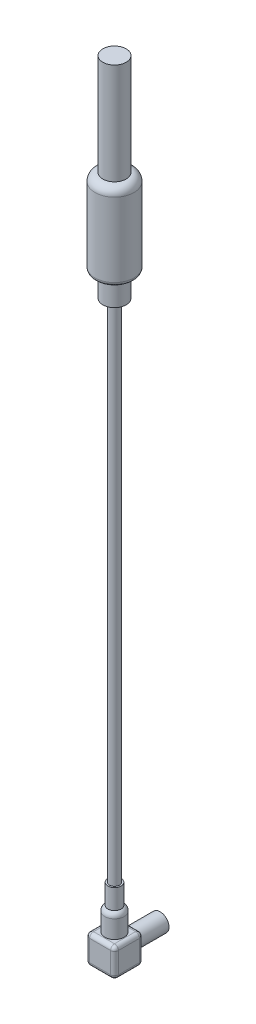
ISO-10303-21;
HEADER;
FILE_DESCRIPTION(('STEP AP214'),'2;1');
FILE_NAME('part.step','',(''),(''),'','','');
FILE_SCHEMA(('AUTOMOTIVE_DESIGN { 1 0 10303 214 1 1 1 1 }'));
ENDSEC;
DATA;
#1=APPLICATION_CONTEXT('core data for automotive mechanical design processes');
#2=APPLICATION_PROTOCOL_DEFINITION('international standard','automotive_design',2000,#1);
#3=PRODUCT_CONTEXT('',#1,'mechanical');
#4=PRODUCT('Part','Part','',(#3));
#5=PRODUCT_RELATED_PRODUCT_CATEGORY('part','',(#4));
#6=PRODUCT_DEFINITION_FORMATION('','',#4);
#7=PRODUCT_DEFINITION_CONTEXT('part definition',#1,'design');
#8=PRODUCT_DEFINITION('design','',#6,#7);
#9=PRODUCT_DEFINITION_SHAPE('','',#8);
#10=(LENGTH_UNIT() NAMED_UNIT(*) SI_UNIT(.MILLI.,.METRE.));
#11=(NAMED_UNIT(*) PLANE_ANGLE_UNIT() SI_UNIT($,.RADIAN.));
#12=(NAMED_UNIT(*) SI_UNIT($,.STERADIAN.) SOLID_ANGLE_UNIT());
#13=UNCERTAINTY_MEASURE_WITH_UNIT(LENGTH_MEASURE(1.E-05),#10,'distance_accuracy_value','');
#14=(GEOMETRIC_REPRESENTATION_CONTEXT(3) GLOBAL_UNCERTAINTY_ASSIGNED_CONTEXT((#13)) GLOBAL_UNIT_ASSIGNED_CONTEXT((#10,
#11,#12)) REPRESENTATION_CONTEXT('',''));
#15=CARTESIAN_POINT('',(0.,0.,0.));
#16=DIRECTION('',(0.,0.,1.));
#17=DIRECTION('',(1.,0.,0.));
#18=AXIS2_PLACEMENT_3D('',#15,#16,#17);
#19=CARTESIAN_POINT('',(0.,0.,4.));
#20=DIRECTION('',(0.,0.,-1.));
#21=DIRECTION('',(-1.,0.,0.));
#22=AXIS2_PLACEMENT_3D('',#19,#20,#21);
#23=CYLINDRICAL_SURFACE('',#22,1.15);
#24=CARTESIAN_POINT('',(0.,0.,4.));
#25=DIRECTION('',(0.,0.,1.));
#26=DIRECTION('',(1.,0.,0.));
#27=AXIS2_PLACEMENT_3D('',#24,#25,#26);
#28=CIRCLE('',#27,1.15);
#29=CARTESIAN_POINT('',(1.15,0.,4.));
#30=VERTEX_POINT('',#29);
#31=EDGE_CURVE('E174',#30,#30,#28,.T.);
#32=ORIENTED_EDGE('',*,*,#31,.F.);
#33=EDGE_LOOP('',(#32));
#34=FACE_BOUND('',#33,.T.);
#35=CARTESIAN_POINT('',(0.,0.,0.));
#36=DIRECTION('',(0.,0.,1.));
#37=DIRECTION('',(1.,0.,0.));
#38=AXIS2_PLACEMENT_3D('',#35,#36,#37);
#39=CIRCLE('',#38,1.15);
#40=CARTESIAN_POINT('',(1.15,0.,0.));
#41=VERTEX_POINT('',#40);
#42=EDGE_CURVE('E177',#41,#41,#39,.T.);
#43=ORIENTED_EDGE('',*,*,#42,.T.);
#44=EDGE_LOOP('',(#43));
#45=FACE_BOUND('',#44,.T.);
#46=ADVANCED_FACE('F47',(#34,#45),#23,.T.);
#47=CARTESIAN_POINT('',(0.,0.,0.));
#48=DIRECTION('',(0.,0.,1.));
#49=DIRECTION('',(1.,0.,0.));
#50=AXIS2_PLACEMENT_3D('',#47,#48,#49);
#51=PLANE('',#50);
#52=ORIENTED_EDGE('',*,*,#42,.F.);
#53=EDGE_LOOP('',(#52));
#54=FACE_BOUND('',#53,.T.);
#55=ADVANCED_FACE('F413',(#54),#51,.F.);
#56=CARTESIAN_POINT('',(-1.85,-1.85,7.7));
#57=DIRECTION('',(1.,0.,0.));
#58=DIRECTION('',(0.,0.,-1.));
#59=AXIS2_PLACEMENT_3D('',#56,#57,#58);
#60=PLANE('',#59);
#61=DIRECTION('',(0.,0.,-1.));
#62=VECTOR('',#61,1.);
#63=CARTESIAN_POINT('',(-1.85,1.35,7.7));
#64=LINE('',#63,#62);
#65=CARTESIAN_POINT('',(-1.85,1.35,7.2));
#66=VERTEX_POINT('',#65);
#67=CARTESIAN_POINT('',(-1.85,1.35,4.5));
#68=VERTEX_POINT('',#67);
#69=EDGE_CURVE('E145',#66,#68,#64,.T.);
#70=ORIENTED_EDGE('',*,*,#69,.T.);
#71=DIRECTION('',(0.,-1.,0.));
#72=VECTOR('',#71,1.);
#73=CARTESIAN_POINT('',(-1.85,-1.85,4.5));
#74=LINE('',#73,#72);
#75=CARTESIAN_POINT('',(-1.85,-1.35,4.5));
#76=VERTEX_POINT('',#75);
#77=EDGE_CURVE('E184',#68,#76,#74,.T.);
#78=ORIENTED_EDGE('',*,*,#77,.T.);
#79=DIRECTION('',(0.,0.,-1.));
#80=VECTOR('',#79,1.);
#81=CARTESIAN_POINT('',(-1.85,-1.35,7.7));
#82=LINE('',#81,#80);
#83=CARTESIAN_POINT('',(-1.85,-1.35,7.2));
#84=VERTEX_POINT('',#83);
#85=EDGE_CURVE('E143',#76,#84,#82,.F.);
#86=ORIENTED_EDGE('',*,*,#85,.T.);
#87=DIRECTION('',(0.,-1.,0.));
#88=VECTOR('',#87,1.);
#89=CARTESIAN_POINT('',(-1.85,1.85,7.2));
#90=LINE('',#89,#88);
#91=EDGE_CURVE('E140',#84,#66,#90,.F.);
#92=ORIENTED_EDGE('',*,*,#91,.T.);
#93=EDGE_LOOP('',(#70,#78,#86,#92));
#94=FACE_BOUND('',#93,.T.);
#95=ADVANCED_FACE('F137',(#94),#60,.F.);
#96=CARTESIAN_POINT('',(1.85,-1.85,7.7));
#97=DIRECTION('',(0.,1.,0.));
#98=DIRECTION('',(-1.,0.,0.));
#99=AXIS2_PLACEMENT_3D('',#96,#97,#98);
#100=PLANE('',#99);
#101=DIRECTION('',(0.,0.,-1.));
#102=VECTOR('',#101,1.);
#103=CARTESIAN_POINT('',(-1.35,-1.85,7.7));
#104=LINE('',#103,#102);
#105=CARTESIAN_POINT('',(-1.35,-1.85,7.2));
#106=VERTEX_POINT('',#105);
#107=CARTESIAN_POINT('',(-1.35,-1.85,4.5));
#108=VERTEX_POINT('',#107);
#109=EDGE_CURVE('E231',#106,#108,#104,.T.);
#110=ORIENTED_EDGE('',*,*,#109,.T.);
#111=DIRECTION('',(1.,0.,0.));
#112=VECTOR('',#111,1.);
#113=CARTESIAN_POINT('',(1.85,-1.85,4.5));
#114=LINE('',#113,#112);
#115=CARTESIAN_POINT('',(1.35,-1.85,4.5));
#116=VERTEX_POINT('',#115);
#117=EDGE_CURVE('E236',#108,#116,#114,.T.);
#118=ORIENTED_EDGE('',*,*,#117,.T.);
#119=DIRECTION('',(0.,0.,-1.));
#120=VECTOR('',#119,1.);
#121=CARTESIAN_POINT('',(1.35,-1.85,7.7));
#122=LINE('',#121,#120);
#123=CARTESIAN_POINT('',(1.35,-1.85,7.2));
#124=VERTEX_POINT('',#123);
#125=EDGE_CURVE('E229',#116,#124,#122,.F.);
#126=ORIENTED_EDGE('',*,*,#125,.T.);
#127=DIRECTION('',(1.,0.,0.));
#128=VECTOR('',#127,1.);
#129=CARTESIAN_POINT('',(-1.85,-1.85,7.2));
#130=LINE('',#129,#128);
#131=EDGE_CURVE('E227',#124,#106,#130,.F.);
#132=ORIENTED_EDGE('',*,*,#131,.T.);
#133=EDGE_LOOP('',(#110,#118,#126,#132));
#134=FACE_BOUND('',#133,.T.);
#135=ADVANCED_FACE('F544',(#134),#100,.F.);
#136=CARTESIAN_POINT('',(1.85,-1.85,7.7));
#137=DIRECTION('',(-1.,0.,0.));
#138=DIRECTION('',(0.,0.,1.));
#139=AXIS2_PLACEMENT_3D('',#136,#137,#138);
#140=PLANE('',#139);
#141=DIRECTION('',(0.,0.,-1.));
#142=VECTOR('',#141,1.);
#143=CARTESIAN_POINT('',(1.85,-1.35,7.7));
#144=LINE('',#143,#142);
#145=CARTESIAN_POINT('',(1.85,-1.35,7.2));
#146=VERTEX_POINT('',#145);
#147=CARTESIAN_POINT('',(1.85,-1.35,4.5));
#148=VERTEX_POINT('',#147);
#149=EDGE_CURVE('E219',#146,#148,#144,.T.);
#150=ORIENTED_EDGE('',*,*,#149,.T.);
#151=DIRECTION('',(0.,1.,0.));
#152=VECTOR('',#151,1.);
#153=CARTESIAN_POINT('',(1.85,-1.85,4.5));
#154=LINE('',#153,#152);
#155=CARTESIAN_POINT('',(1.85,1.35,4.5));
#156=VERTEX_POINT('',#155);
#157=EDGE_CURVE('E223',#148,#156,#154,.T.);
#158=ORIENTED_EDGE('',*,*,#157,.T.);
#159=DIRECTION('',(0.,0.,-1.));
#160=VECTOR('',#159,1.);
#161=CARTESIAN_POINT('',(1.85,1.35,7.7));
#162=LINE('',#161,#160);
#163=CARTESIAN_POINT('',(1.85,1.35,7.2));
#164=VERTEX_POINT('',#163);
#165=EDGE_CURVE('E211',#156,#164,#162,.F.);
#166=ORIENTED_EDGE('',*,*,#165,.T.);
#167=DIRECTION('',(0.,1.,0.));
#168=VECTOR('',#167,1.);
#169=CARTESIAN_POINT('',(1.85,-1.85,7.2));
#170=LINE('',#169,#168);
#171=EDGE_CURVE('E220',#164,#146,#170,.F.);
#172=ORIENTED_EDGE('',*,*,#171,.T.);
#173=EDGE_LOOP('',(#150,#158,#166,#172));
#174=FACE_BOUND('',#173,.T.);
#175=ADVANCED_FACE('F537',(#174),#140,.F.);
#176=CARTESIAN_POINT('',(1.85,1.85,7.7));
#177=DIRECTION('',(0.,-1.,0.));
#178=DIRECTION('',(1.,0.,0.));
#179=AXIS2_PLACEMENT_3D('',#176,#177,#178);
#180=PLANE('',#179);
#181=CARTESIAN_POINT('',(0.,1.85,5.85));
#182=DIRECTION('',(0.,-1.,0.));
#183=DIRECTION('',(1.,0.,0.));
#184=AXIS2_PLACEMENT_3D('',#181,#182,#183);
#185=CIRCLE('',#184,1.25);
#186=CARTESIAN_POINT('',(1.25,1.85,5.85));
#187=VERTEX_POINT('',#186);
#188=EDGE_CURVE('E249',#187,#187,#185,.F.);
#189=ORIENTED_EDGE('',*,*,#188,.F.);
#190=EDGE_LOOP('',(#189));
#191=FACE_BOUND('',#190,.T.);
#192=DIRECTION('',(-1.,0.,0.));
#193=VECTOR('',#192,1.);
#194=CARTESIAN_POINT('',(1.85,1.85,4.5));
#195=LINE('',#194,#193);
#196=CARTESIAN_POINT('',(1.35,1.85,4.5));
#197=VERTEX_POINT('',#196);
#198=CARTESIAN_POINT('',(-1.35,1.85,4.5));
#199=VERTEX_POINT('',#198);
#200=EDGE_CURVE('E210',#197,#199,#195,.T.);
#201=ORIENTED_EDGE('',*,*,#200,.T.);
#202=DIRECTION('',(0.,0.,-1.));
#203=VECTOR('',#202,1.);
#204=CARTESIAN_POINT('',(-1.35,1.85,7.7));
#205=LINE('',#204,#203);
#206=CARTESIAN_POINT('',(-1.35,1.85,7.2));
#207=VERTEX_POINT('',#206);
#208=EDGE_CURVE('E212',#199,#207,#205,.F.);
#209=ORIENTED_EDGE('',*,*,#208,.T.);
#210=DIRECTION('',(-1.,0.,0.));
#211=VECTOR('',#210,1.);
#212=CARTESIAN_POINT('',(1.85,1.85,7.2));
#213=LINE('',#212,#211);
#214=CARTESIAN_POINT('',(1.35,1.85,7.2));
#215=VERTEX_POINT('',#214);
#216=EDGE_CURVE('E202',#207,#215,#213,.F.);
#217=ORIENTED_EDGE('',*,*,#216,.T.);
#218=DIRECTION('',(0.,0.,-1.));
#219=VECTOR('',#218,1.);
#220=CARTESIAN_POINT('',(1.35,1.85,7.7));
#221=LINE('',#220,#219);
#222=EDGE_CURVE('E201',#215,#197,#221,.T.);
#223=ORIENTED_EDGE('',*,*,#222,.T.);
#224=EDGE_LOOP('',(#201,#209,#217,#223));
#225=FACE_BOUND('',#224,.T.);
#226=ADVANCED_FACE('F517',(#191,#225),#180,.F.);
#227=CARTESIAN_POINT('',(0.,0.,7.7));
#228=DIRECTION('',(0.,0.,1.));
#229=DIRECTION('',(1.,0.,0.));
#230=AXIS2_PLACEMENT_3D('',#227,#228,#229);
#231=PLANE('',#230);
#232=DIRECTION('',(0.,-1.,0.));
#233=VECTOR('',#232,1.);
#234=CARTESIAN_POINT('',(-1.35,-1.85,7.7));
#235=LINE('',#234,#233);
#236=CARTESIAN_POINT('',(-1.35,1.35,7.7));
#237=VERTEX_POINT('',#236);
#238=CARTESIAN_POINT('',(-1.35,-1.35,7.7));
#239=VERTEX_POINT('',#238);
#240=EDGE_CURVE('E69',#237,#239,#235,.T.);
#241=ORIENTED_EDGE('',*,*,#240,.T.);
#242=DIRECTION('',(1.,0.,0.));
#243=VECTOR('',#242,1.);
#244=CARTESIAN_POINT('',(1.85,-1.35,7.7));
#245=LINE('',#244,#243);
#246=CARTESIAN_POINT('',(1.35,-1.35,7.7));
#247=VERTEX_POINT('',#246);
#248=EDGE_CURVE('E63',#239,#247,#245,.T.);
#249=ORIENTED_EDGE('',*,*,#248,.T.);
#250=DIRECTION('',(0.,1.,0.));
#251=VECTOR('',#250,1.);
#252=CARTESIAN_POINT('',(1.35,1.85,7.7));
#253=LINE('',#252,#251);
#254=CARTESIAN_POINT('',(1.35,1.35,7.7));
#255=VERTEX_POINT('',#254);
#256=EDGE_CURVE('E244',#247,#255,#253,.T.);
#257=ORIENTED_EDGE('',*,*,#256,.T.);
#258=DIRECTION('',(-1.,0.,0.));
#259=VECTOR('',#258,1.);
#260=CARTESIAN_POINT('',(-1.85,1.35,7.7));
#261=LINE('',#260,#259);
#262=EDGE_CURVE('E239',#255,#237,#261,.T.);
#263=ORIENTED_EDGE('',*,*,#262,.T.);
#264=EDGE_LOOP('',(#241,#249,#257,#263));
#265=FACE_BOUND('',#264,.T.);
#266=ADVANCED_FACE('F505',(#265),#231,.T.);
#267=CARTESIAN_POINT('',(0.,0.,4.));
#268=DIRECTION('',(0.,0.,1.));
#269=DIRECTION('',(1.,0.,0.));
#270=AXIS2_PLACEMENT_3D('',#267,#268,#269);
#271=PLANE('',#270);
#272=DIRECTION('',(1.,0.,0.));
#273=VECTOR('',#272,1.);
#274=CARTESIAN_POINT('',(0.,-1.35,4.));
#275=LINE('',#274,#273);
#276=CARTESIAN_POINT('',(1.35,-1.35,4.));
#277=VERTEX_POINT('',#276);
#278=CARTESIAN_POINT('',(-1.35,-1.35,4.));
#279=VERTEX_POINT('',#278);
#280=EDGE_CURVE('E189',#277,#279,#275,.F.);
#281=ORIENTED_EDGE('',*,*,#280,.T.);
#282=DIRECTION('',(0.,-1.,0.));
#283=VECTOR('',#282,1.);
#284=CARTESIAN_POINT('',(-1.35,0.,4.));
#285=LINE('',#284,#283);
#286=CARTESIAN_POINT('',(-1.35,1.35,4.));
#287=VERTEX_POINT('',#286);
#288=EDGE_CURVE('E200',#279,#287,#285,.F.);
#289=ORIENTED_EDGE('',*,*,#288,.T.);
#290=DIRECTION('',(-1.,0.,0.));
#291=VECTOR('',#290,1.);
#292=CARTESIAN_POINT('',(0.,1.35,4.));
#293=LINE('',#292,#291);
#294=CARTESIAN_POINT('',(1.35,1.35,4.));
#295=VERTEX_POINT('',#294);
#296=EDGE_CURVE('E191',#287,#295,#293,.F.);
#297=ORIENTED_EDGE('',*,*,#296,.T.);
#298=DIRECTION('',(0.,1.,0.));
#299=VECTOR('',#298,1.);
#300=CARTESIAN_POINT('',(1.35,0.,4.));
#301=LINE('',#300,#299);
#302=EDGE_CURVE('E192',#295,#277,#301,.F.);
#303=ORIENTED_EDGE('',*,*,#302,.T.);
#304=EDGE_LOOP('',(#281,#289,#297,#303));
#305=FACE_BOUND('',#304,.T.);
#306=ORIENTED_EDGE('',*,*,#31,.T.);
#307=EDGE_LOOP('',(#306));
#308=FACE_BOUND('',#307,.T.);
#309=ADVANCED_FACE('F500',(#305,#308),#271,.F.);
#310=CARTESIAN_POINT('',(1.35,0.,7.2));
#311=DIRECTION('',(0.,-1.,0.));
#312=DIRECTION('',(0.,0.,-1.));
#313=AXIS2_PLACEMENT_3D('',#310,#311,#312);
#314=CYLINDRICAL_SURFACE('',#313,0.5);
#315=CARTESIAN_POINT('',(1.35,1.35,7.2));
#316=DIRECTION('',(0.,1.,0.));
#317=DIRECTION('',(0.,0.,1.));
#318=AXIS2_PLACEMENT_3D('',#315,#316,#317);
#319=CIRCLE('',#318,0.5);
#320=EDGE_CURVE('E321',#255,#164,#319,.T.);
#321=ORIENTED_EDGE('',*,*,#320,.F.);
#322=ORIENTED_EDGE('',*,*,#256,.F.);
#323=CARTESIAN_POINT('',(1.35,-1.35,7.2));
#324=DIRECTION('',(0.,-1.,0.));
#325=DIRECTION('',(0.,0.,-1.));
#326=AXIS2_PLACEMENT_3D('',#323,#324,#325);
#327=CIRCLE('',#326,0.5);
#328=EDGE_CURVE('E318',#146,#247,#327,.T.);
#329=ORIENTED_EDGE('',*,*,#328,.F.);
#330=ORIENTED_EDGE('',*,*,#171,.F.);
#331=EDGE_LOOP('',(#321,#322,#329,#330));
#332=FACE_BOUND('',#331,.T.);
#333=ADVANCED_FACE('F494',(#332),#314,.T.);
#334=CARTESIAN_POINT('',(1.35,1.35,7.2));
#335=DIRECTION('',(1.,0.,0.));
#336=DIRECTION('',(0.,0.,-1.));
#337=AXIS2_PLACEMENT_3D('',#334,#335,#336);
#338=SPHERICAL_SURFACE('',#337,0.5);
#339=CARTESIAN_POINT('',(1.35,1.35,7.2));
#340=DIRECTION('',(1.,0.,0.));
#341=DIRECTION('',(0.,0.,-1.));
#342=AXIS2_PLACEMENT_3D('',#339,#340,#341);
#343=CIRCLE('',#342,0.5);
#344=EDGE_CURVE('E315',#255,#215,#343,.F.);
#345=ORIENTED_EDGE('',*,*,#344,.F.);
#346=ORIENTED_EDGE('',*,*,#320,.T.);
#347=CARTESIAN_POINT('',(1.35,1.35,7.2));
#348=DIRECTION('',(0.,0.,1.));
#349=DIRECTION('',(1.,0.,0.));
#350=AXIS2_PLACEMENT_3D('',#347,#348,#349);
#351=CIRCLE('',#350,0.5);
#352=EDGE_CURVE('E317',#215,#164,#351,.F.);
#353=ORIENTED_EDGE('',*,*,#352,.F.);
#354=EDGE_LOOP('',(#345,#346,#353));
#355=FACE_BOUND('',#354,.T.);
#356=ADVANCED_FACE('F489',(#355),#338,.T.);
#357=CARTESIAN_POINT('',(1.35,-1.35,7.2));
#358=DIRECTION('',(0.,0.,1.));
#359=DIRECTION('',(1.,0.,0.));
#360=AXIS2_PLACEMENT_3D('',#357,#358,#359);
#361=SPHERICAL_SURFACE('',#360,0.5);
#362=CARTESIAN_POINT('',(1.35,-1.35,7.2));
#363=DIRECTION('',(0.,0.,1.));
#364=DIRECTION('',(1.,0.,0.));
#365=AXIS2_PLACEMENT_3D('',#362,#363,#364);
#366=CIRCLE('',#365,0.5);
#367=EDGE_CURVE('E302',#146,#124,#366,.F.);
#368=ORIENTED_EDGE('',*,*,#367,.F.);
#369=ORIENTED_EDGE('',*,*,#328,.T.);
#370=CARTESIAN_POINT('',(1.35,-1.35,7.2));
#371=DIRECTION('',(1.,0.,0.));
#372=DIRECTION('',(0.,0.,-1.));
#373=AXIS2_PLACEMENT_3D('',#370,#371,#372);
#374=CIRCLE('',#373,0.5);
#375=EDGE_CURVE('E308',#124,#247,#374,.F.);
#376=ORIENTED_EDGE('',*,*,#375,.F.);
#377=EDGE_LOOP('',(#368,#369,#376));
#378=FACE_BOUND('',#377,.T.);
#379=ADVANCED_FACE('F488',(#378),#361,.T.);
#380=CARTESIAN_POINT('',(1.35,1.35,7.7));
#381=DIRECTION('',(0.,0.,-1.));
#382=DIRECTION('',(-1.,0.,0.));
#383=AXIS2_PLACEMENT_3D('',#380,#381,#382);
#384=CYLINDRICAL_SURFACE('',#383,0.5);
#385=ORIENTED_EDGE('',*,*,#352,.T.);
#386=ORIENTED_EDGE('',*,*,#165,.F.);
#387=CARTESIAN_POINT('',(1.35,1.35,4.5));
#388=DIRECTION('',(0.,0.,-1.));
#389=DIRECTION('',(-1.,0.,0.));
#390=AXIS2_PLACEMENT_3D('',#387,#388,#389);
#391=CIRCLE('',#390,0.5);
#392=EDGE_CURVE('E300',#197,#156,#391,.T.);
#393=ORIENTED_EDGE('',*,*,#392,.F.);
#394=ORIENTED_EDGE('',*,*,#222,.F.);
#395=EDGE_LOOP('',(#385,#386,#393,#394));
#396=FACE_BOUND('',#395,.T.);
#397=ADVANCED_FACE('F485',(#396),#384,.T.);
#398=CARTESIAN_POINT('',(0.,1.35,7.2));
#399=DIRECTION('',(1.,0.,0.));
#400=DIRECTION('',(0.,1.,0.));
#401=AXIS2_PLACEMENT_3D('',#398,#399,#400);
#402=CYLINDRICAL_SURFACE('',#401,0.5);
#403=ORIENTED_EDGE('',*,*,#344,.T.);
#404=ORIENTED_EDGE('',*,*,#216,.F.);
#405=CARTESIAN_POINT('',(-1.35,1.35,7.2));
#406=DIRECTION('',(-1.,0.,0.));
#407=DIRECTION('',(0.,0.,1.));
#408=AXIS2_PLACEMENT_3D('',#405,#406,#407);
#409=CIRCLE('',#408,0.5);
#410=EDGE_CURVE('E157',#237,#207,#409,.T.);
#411=ORIENTED_EDGE('',*,*,#410,.F.);
#412=ORIENTED_EDGE('',*,*,#262,.F.);
#413=EDGE_LOOP('',(#403,#404,#411,#412));
#414=FACE_BOUND('',#413,.T.);
#415=ADVANCED_FACE('F477',(#414),#402,.T.);
#416=CARTESIAN_POINT('',(-1.35,0.,7.2));
#417=DIRECTION('',(0.,1.,0.));
#418=DIRECTION('',(0.,0.,1.));
#419=AXIS2_PLACEMENT_3D('',#416,#417,#418);
#420=CYLINDRICAL_SURFACE('',#419,0.5);
#421=CARTESIAN_POINT('',(-1.35,-1.35,7.2));
#422=DIRECTION('',(0.,-1.,0.));
#423=DIRECTION('',(0.,0.,-1.));
#424=AXIS2_PLACEMENT_3D('',#421,#422,#423);
#425=CIRCLE('',#424,0.5);
#426=EDGE_CURVE('E159',#239,#84,#425,.T.);
#427=ORIENTED_EDGE('',*,*,#426,.F.);
#428=ORIENTED_EDGE('',*,*,#240,.F.);
#429=CARTESIAN_POINT('',(-1.35,1.35,7.2));
#430=DIRECTION('',(0.,1.,0.));
#431=DIRECTION('',(0.,0.,1.));
#432=AXIS2_PLACEMENT_3D('',#429,#430,#431);
#433=CIRCLE('',#432,0.5);
#434=EDGE_CURVE('E155',#66,#237,#433,.T.);
#435=ORIENTED_EDGE('',*,*,#434,.F.);
#436=ORIENTED_EDGE('',*,*,#91,.F.);
#437=EDGE_LOOP('',(#427,#428,#435,#436));
#438=FACE_BOUND('',#437,.T.);
#439=ADVANCED_FACE('F152',(#438),#420,.T.);
#440=CARTESIAN_POINT('',(0.,-1.35,7.2));
#441=DIRECTION('',(-1.,0.,0.));
#442=DIRECTION('',(0.,-1.,0.));
#443=AXIS2_PLACEMENT_3D('',#440,#441,#442);
#444=CYLINDRICAL_SURFACE('',#443,0.5);
#445=ORIENTED_EDGE('',*,*,#375,.T.);
#446=ORIENTED_EDGE('',*,*,#248,.F.);
#447=CARTESIAN_POINT('',(-1.35,-1.35,7.2));
#448=DIRECTION('',(-1.,0.,0.));
#449=DIRECTION('',(0.,0.,1.));
#450=AXIS2_PLACEMENT_3D('',#447,#448,#449);
#451=CIRCLE('',#450,0.5);
#452=EDGE_CURVE('E287',#106,#239,#451,.T.);
#453=ORIENTED_EDGE('',*,*,#452,.F.);
#454=ORIENTED_EDGE('',*,*,#131,.F.);
#455=EDGE_LOOP('',(#445,#446,#453,#454));
#456=FACE_BOUND('',#455,.T.);
#457=ADVANCED_FACE('F475',(#456),#444,.T.);
#458=CARTESIAN_POINT('',(1.35,-1.35,7.7));
#459=DIRECTION('',(0.,0.,-1.));
#460=DIRECTION('',(-1.,0.,0.));
#461=AXIS2_PLACEMENT_3D('',#458,#459,#460);
#462=CYLINDRICAL_SURFACE('',#461,0.5);
#463=ORIENTED_EDGE('',*,*,#367,.T.);
#464=ORIENTED_EDGE('',*,*,#125,.F.);
#465=CARTESIAN_POINT('',(1.35,-1.35,4.5));
#466=DIRECTION('',(0.,0.,-1.));
#467=DIRECTION('',(-1.,0.,0.));
#468=AXIS2_PLACEMENT_3D('',#465,#466,#467);
#469=CIRCLE('',#468,0.5);
#470=EDGE_CURVE('E284',#148,#116,#469,.T.);
#471=ORIENTED_EDGE('',*,*,#470,.F.);
#472=ORIENTED_EDGE('',*,*,#149,.F.);
#473=EDGE_LOOP('',(#463,#464,#471,#472));
#474=FACE_BOUND('',#473,.T.);
#475=ADVANCED_FACE('F466',(#474),#462,.T.);
#476=CARTESIAN_POINT('',(1.35,-1.85,4.5));
#477=DIRECTION('',(0.,1.,0.));
#478=DIRECTION('',(0.,0.,1.));
#479=AXIS2_PLACEMENT_3D('',#476,#477,#478);
#480=CYLINDRICAL_SURFACE('',#479,0.5);
#481=CARTESIAN_POINT('',(1.35,1.35,4.5));
#482=DIRECTION('',(0.,1.,0.));
#483=DIRECTION('',(0.,0.,1.));
#484=AXIS2_PLACEMENT_3D('',#481,#482,#483);
#485=CIRCLE('',#484,0.5);
#486=EDGE_CURVE('E297',#156,#295,#485,.T.);
#487=ORIENTED_EDGE('',*,*,#486,.F.);
#488=ORIENTED_EDGE('',*,*,#157,.F.);
#489=CARTESIAN_POINT('',(1.35,-1.35,4.5));
#490=DIRECTION('',(0.,-1.,0.));
#491=DIRECTION('',(0.,0.,-1.));
#492=AXIS2_PLACEMENT_3D('',#489,#490,#491);
#493=CIRCLE('',#492,0.5);
#494=EDGE_CURVE('E281',#277,#148,#493,.T.);
#495=ORIENTED_EDGE('',*,*,#494,.F.);
#496=ORIENTED_EDGE('',*,*,#302,.F.);
#497=EDGE_LOOP('',(#487,#488,#495,#496));
#498=FACE_BOUND('',#497,.T.);
#499=ADVANCED_FACE('F462',(#498),#480,.T.);
#500=CARTESIAN_POINT('',(1.35,1.35,4.5));
#501=DIRECTION('',(1.,0.,0.));
#502=DIRECTION('',(0.,0.,-1.));
#503=AXIS2_PLACEMENT_3D('',#500,#501,#502);
#504=SPHERICAL_SURFACE('',#503,0.5);
#505=ORIENTED_EDGE('',*,*,#392,.T.);
#506=ORIENTED_EDGE('',*,*,#486,.T.);
#507=CARTESIAN_POINT('',(1.35,1.35,4.5));
#508=DIRECTION('',(1.,0.,0.));
#509=DIRECTION('',(0.,0.,-1.));
#510=AXIS2_PLACEMENT_3D('',#507,#508,#509);
#511=CIRCLE('',#510,0.5);
#512=EDGE_CURVE('E166',#197,#295,#511,.F.);
#513=ORIENTED_EDGE('',*,*,#512,.F.);
#514=EDGE_LOOP('',(#505,#506,#513));
#515=FACE_BOUND('',#514,.T.);
#516=ADVANCED_FACE('F461',(#515),#504,.T.);
#517=CARTESIAN_POINT('',(-1.35,1.35,7.2));
#518=DIRECTION('',(0.,0.,1.));
#519=DIRECTION('',(1.,0.,0.));
#520=AXIS2_PLACEMENT_3D('',#517,#518,#519);
#521=SPHERICAL_SURFACE('',#520,0.5);
#522=ORIENTED_EDGE('',*,*,#434,.T.);
#523=ORIENTED_EDGE('',*,*,#410,.T.);
#524=CARTESIAN_POINT('',(-1.35,1.35,7.2));
#525=DIRECTION('',(0.,0.,1.));
#526=DIRECTION('',(1.,0.,0.));
#527=AXIS2_PLACEMENT_3D('',#524,#525,#526);
#528=CIRCLE('',#527,0.5);
#529=EDGE_CURVE('E161',#66,#207,#528,.F.);
#530=ORIENTED_EDGE('',*,*,#529,.F.);
#531=EDGE_LOOP('',(#522,#523,#530));
#532=FACE_BOUND('',#531,.T.);
#533=ADVANCED_FACE('F165',(#532),#521,.T.);
#534=CARTESIAN_POINT('',(-1.35,-1.35,7.2));
#535=DIRECTION('',(0.,0.,1.));
#536=DIRECTION('',(1.,0.,0.));
#537=AXIS2_PLACEMENT_3D('',#534,#535,#536);
#538=SPHERICAL_SURFACE('',#537,0.5);
#539=ORIENTED_EDGE('',*,*,#452,.T.);
#540=ORIENTED_EDGE('',*,*,#426,.T.);
#541=CARTESIAN_POINT('',(-1.35,-1.35,7.2));
#542=DIRECTION('',(0.,0.,1.));
#543=DIRECTION('',(1.,0.,0.));
#544=AXIS2_PLACEMENT_3D('',#541,#542,#543);
#545=CIRCLE('',#544,0.5);
#546=EDGE_CURVE('E169',#106,#84,#545,.F.);
#547=ORIENTED_EDGE('',*,*,#546,.F.);
#548=EDGE_LOOP('',(#539,#540,#547));
#549=FACE_BOUND('',#548,.T.);
#550=ADVANCED_FACE('F451',(#549),#538,.T.);
#551=CARTESIAN_POINT('',(1.35,-1.35,4.5));
#552=DIRECTION('',(1.,0.,0.));
#553=DIRECTION('',(0.,0.,-1.));
#554=AXIS2_PLACEMENT_3D('',#551,#552,#553);
#555=SPHERICAL_SURFACE('',#554,0.5);
#556=ORIENTED_EDGE('',*,*,#494,.T.);
#557=ORIENTED_EDGE('',*,*,#470,.T.);
#558=CARTESIAN_POINT('',(1.35,-1.35,4.5));
#559=DIRECTION('',(1.,0.,0.));
#560=DIRECTION('',(0.,0.,-1.));
#561=AXIS2_PLACEMENT_3D('',#558,#559,#560);
#562=CIRCLE('',#561,0.5);
#563=EDGE_CURVE('E275',#277,#116,#562,.F.);
#564=ORIENTED_EDGE('',*,*,#563,.F.);
#565=EDGE_LOOP('',(#556,#557,#564));
#566=FACE_BOUND('',#565,.T.);
#567=ADVANCED_FACE('F448',(#566),#555,.T.);
#568=CARTESIAN_POINT('',(1.85,1.35,4.5));
#569=DIRECTION('',(-1.,0.,0.));
#570=DIRECTION('',(0.,-1.,0.));
#571=AXIS2_PLACEMENT_3D('',#568,#569,#570);
#572=CYLINDRICAL_SURFACE('',#571,0.5);
#573=ORIENTED_EDGE('',*,*,#512,.T.);
#574=ORIENTED_EDGE('',*,*,#296,.F.);
#575=CARTESIAN_POINT('',(-1.35,1.35,4.5));
#576=DIRECTION('',(-1.,0.,0.));
#577=DIRECTION('',(0.,0.,1.));
#578=AXIS2_PLACEMENT_3D('',#575,#576,#577);
#579=CIRCLE('',#578,0.5);
#580=EDGE_CURVE('E268',#199,#287,#579,.T.);
#581=ORIENTED_EDGE('',*,*,#580,.F.);
#582=ORIENTED_EDGE('',*,*,#200,.F.);
#583=EDGE_LOOP('',(#573,#574,#581,#582));
#584=FACE_BOUND('',#583,.T.);
#585=ADVANCED_FACE('F450',(#584),#572,.T.);
#586=CARTESIAN_POINT('',(-1.35,1.35,7.7));
#587=DIRECTION('',(0.,0.,-1.));
#588=DIRECTION('',(-1.,0.,0.));
#589=AXIS2_PLACEMENT_3D('',#586,#587,#588);
#590=CYLINDRICAL_SURFACE('',#589,0.5);
#591=ORIENTED_EDGE('',*,*,#529,.T.);
#592=ORIENTED_EDGE('',*,*,#208,.F.);
#593=CARTESIAN_POINT('',(-1.35,1.35,4.5));
#594=DIRECTION('',(0.,0.,-1.));
#595=DIRECTION('',(-1.,0.,0.));
#596=AXIS2_PLACEMENT_3D('',#593,#594,#595);
#597=CIRCLE('',#596,0.5);
#598=EDGE_CURVE('E175',#68,#199,#597,.T.);
#599=ORIENTED_EDGE('',*,*,#598,.F.);
#600=ORIENTED_EDGE('',*,*,#69,.F.);
#601=EDGE_LOOP('',(#591,#592,#599,#600));
#602=FACE_BOUND('',#601,.T.);
#603=ADVANCED_FACE('F171',(#602),#590,.T.);
#604=CARTESIAN_POINT('',(-1.35,-1.35,7.7));
#605=DIRECTION('',(0.,0.,-1.));
#606=DIRECTION('',(-1.,0.,0.));
#607=AXIS2_PLACEMENT_3D('',#604,#605,#606);
#608=CYLINDRICAL_SURFACE('',#607,0.5);
#609=ORIENTED_EDGE('',*,*,#546,.T.);
#610=ORIENTED_EDGE('',*,*,#85,.F.);
#611=CARTESIAN_POINT('',(-1.35,-1.35,4.5));
#612=DIRECTION('',(0.,0.,-1.));
#613=DIRECTION('',(-1.,0.,0.));
#614=AXIS2_PLACEMENT_3D('',#611,#612,#613);
#615=CIRCLE('',#614,0.5);
#616=EDGE_CURVE('E265',#108,#76,#615,.T.);
#617=ORIENTED_EDGE('',*,*,#616,.F.);
#618=ORIENTED_EDGE('',*,*,#109,.F.);
#619=EDGE_LOOP('',(#609,#610,#617,#618));
#620=FACE_BOUND('',#619,.T.);
#621=ADVANCED_FACE('F439',(#620),#608,.T.);
#622=CARTESIAN_POINT('',(1.85,-1.35,4.5));
#623=DIRECTION('',(1.,0.,0.));
#624=DIRECTION('',(0.,1.,0.));
#625=AXIS2_PLACEMENT_3D('',#622,#623,#624);
#626=CYLINDRICAL_SURFACE('',#625,0.5);
#627=ORIENTED_EDGE('',*,*,#563,.T.);
#628=ORIENTED_EDGE('',*,*,#117,.F.);
#629=CARTESIAN_POINT('',(-1.35,-1.35,4.5));
#630=DIRECTION('',(-1.,0.,0.));
#631=DIRECTION('',(0.,0.,1.));
#632=AXIS2_PLACEMENT_3D('',#629,#630,#631);
#633=CIRCLE('',#632,0.5);
#634=EDGE_CURVE('E259',#279,#108,#633,.T.);
#635=ORIENTED_EDGE('',*,*,#634,.F.);
#636=ORIENTED_EDGE('',*,*,#280,.F.);
#637=EDGE_LOOP('',(#627,#628,#635,#636));
#638=FACE_BOUND('',#637,.T.);
#639=ADVANCED_FACE('F436',(#638),#626,.T.);
#640=CARTESIAN_POINT('',(-1.35,1.35,4.5));
#641=DIRECTION('',(0.,1.,0.));
#642=DIRECTION('',(0.,0.,1.));
#643=AXIS2_PLACEMENT_3D('',#640,#641,#642);
#644=SPHERICAL_SURFACE('',#643,0.5);
#645=ORIENTED_EDGE('',*,*,#598,.T.);
#646=ORIENTED_EDGE('',*,*,#580,.T.);
#647=CARTESIAN_POINT('',(-1.35,1.35,4.5));
#648=DIRECTION('',(0.,1.,0.));
#649=DIRECTION('',(0.,0.,1.));
#650=AXIS2_PLACEMENT_3D('',#647,#648,#649);
#651=CIRCLE('',#650,0.5);
#652=EDGE_CURVE('E251',#68,#287,#651,.F.);
#653=ORIENTED_EDGE('',*,*,#652,.F.);
#654=EDGE_LOOP('',(#645,#646,#653));
#655=FACE_BOUND('',#654,.T.);
#656=ADVANCED_FACE('F435',(#655),#644,.T.);
#657=CARTESIAN_POINT('',(-1.35,-1.35,4.5));
#658=DIRECTION('',(0.,-1.,0.));
#659=DIRECTION('',(0.,0.,-1.));
#660=AXIS2_PLACEMENT_3D('',#657,#658,#659);
#661=SPHERICAL_SURFACE('',#660,0.5);
#662=ORIENTED_EDGE('',*,*,#634,.T.);
#663=ORIENTED_EDGE('',*,*,#616,.T.);
#664=CARTESIAN_POINT('',(-1.35,-1.35,4.5));
#665=DIRECTION('',(0.,-1.,0.));
#666=DIRECTION('',(0.,0.,-1.));
#667=AXIS2_PLACEMENT_3D('',#664,#665,#666);
#668=CIRCLE('',#667,0.5);
#669=EDGE_CURVE('E252',#279,#76,#668,.F.);
#670=ORIENTED_EDGE('',*,*,#669,.F.);
#671=EDGE_LOOP('',(#662,#663,#670));
#672=FACE_BOUND('',#671,.T.);
#673=ADVANCED_FACE('F426',(#672),#661,.T.);
#674=CARTESIAN_POINT('',(-1.35,-1.85,4.5));
#675=DIRECTION('',(0.,-1.,0.));
#676=DIRECTION('',(0.,0.,-1.));
#677=AXIS2_PLACEMENT_3D('',#674,#675,#676);
#678=CYLINDRICAL_SURFACE('',#677,0.5);
#679=ORIENTED_EDGE('',*,*,#652,.T.);
#680=ORIENTED_EDGE('',*,*,#288,.F.);
#681=ORIENTED_EDGE('',*,*,#669,.T.);
#682=ORIENTED_EDGE('',*,*,#77,.F.);
#683=EDGE_LOOP('',(#679,#680,#681,#682));
#684=FACE_BOUND('',#683,.T.);
#685=ADVANCED_FACE('F424',(#684),#678,.T.);
#686=CARTESIAN_POINT('',(0.,4.85,5.85));
#687=DIRECTION('',(0.,-1.,0.));
#688=DIRECTION('',(1.,0.,0.));
#689=AXIS2_PLACEMENT_3D('',#686,#687,#688);
#690=CYLINDRICAL_SURFACE('',#689,1.25);
#691=CARTESIAN_POINT('',(0.,4.15,5.85));
#692=DIRECTION('',(0.,1.,0.));
#693=DIRECTION('',(-1.,0.,0.));
#694=AXIS2_PLACEMENT_3D('',#691,#692,#693);
#695=CIRCLE('',#694,1.25);
#696=CARTESIAN_POINT('',(-1.25,4.15,5.85));
#697=VERTEX_POINT('',#696);
#698=EDGE_CURVE('E331',#697,#697,#695,.F.);
#699=ORIENTED_EDGE('',*,*,#698,.T.);
#700=EDGE_LOOP('',(#699));
#701=FACE_BOUND('',#700,.T.);
#702=ORIENTED_EDGE('',*,*,#188,.T.);
#703=EDGE_LOOP('',(#702));
#704=FACE_BOUND('',#703,.T.);
#705=ADVANCED_FACE('F409',(#701,#704),#690,.T.);
#706=CARTESIAN_POINT('',(0.,4.15,5.85));
#707=DIRECTION('',(0.,1.,0.));
#708=DIRECTION('',(-1.,0.,0.));
#709=AXIS2_PLACEMENT_3D('',#706,#707,#708);
#710=DEGENERATE_TOROIDAL_SURFACE('',#709,0.55,0.7,.T.);
#711=CARTESIAN_POINT('',(0.,4.78245553203368,5.85));
#712=DIRECTION('',(0.,-1.,0.));
#713=DIRECTION('',(1.,0.,0.));
#714=AXIS2_PLACEMENT_3D('',#711,#712,#713);
#715=CIRCLE('',#714,0.85);
#716=CARTESIAN_POINT('',(0.85,4.78245553203368,5.85));
#717=VERTEX_POINT('',#716);
#718=EDGE_CURVE('E334',#717,#717,#715,.F.);
#719=ORIENTED_EDGE('',*,*,#718,.F.);
#720=EDGE_LOOP('',(#719));
#721=FACE_BOUND('',#720,.T.);
#722=ORIENTED_EDGE('',*,*,#698,.F.);
#723=EDGE_LOOP('',(#722));
#724=FACE_BOUND('',#723,.T.);
#725=ADVANCED_FACE('F398',(#721,#724),#710,.T.);
#726=CARTESIAN_POINT('',(0.,-1.851,5.85));
#727=DIRECTION('',(0.,1.,0.));
#728=DIRECTION('',(-1.,0.,0.));
#729=AXIS2_PLACEMENT_3D('',#726,#727,#728);
#730=CYLINDRICAL_SURFACE('',#729,0.85);
#731=ORIENTED_EDGE('',*,*,#718,.T.);
#732=EDGE_LOOP('',(#731));
#733=FACE_BOUND('',#732,.T.);
#734=CARTESIAN_POINT('',(0.,7.35,5.85));
#735=DIRECTION('',(0.,1.,0.));
#736=DIRECTION('',(-1.,0.,0.));
#737=AXIS2_PLACEMENT_3D('',#734,#735,#736);
#738=CIRCLE('',#737,0.85);
#739=CARTESIAN_POINT('',(-0.850000000000001,7.35,5.85));
#740=VERTEX_POINT('',#739);
#741=EDGE_CURVE('E253',#740,#740,#738,.T.);
#742=ORIENTED_EDGE('',*,*,#741,.F.);
#743=EDGE_LOOP('',(#742));
#744=FACE_BOUND('',#743,.T.);
#745=ADVANCED_FACE('F396',(#733,#744),#730,.T.);
#746=CARTESIAN_POINT('',(0.,7.35,5.85));
#747=DIRECTION('',(0.,1.,0.));
#748=DIRECTION('',(-1.,0.,0.));
#749=AXIS2_PLACEMENT_3D('',#746,#747,#748);
#750=PLANE('',#749);
#751=CARTESIAN_POINT('',(0.,7.35,5.85));
#752=DIRECTION('',(0.,1.,0.));
#753=DIRECTION('',(-1.,0.,0.));
#754=AXIS2_PLACEMENT_3D('',#751,#752,#753);
#755=CIRCLE('',#754,0.65);
#756=CARTESIAN_POINT('',(-0.650000000000001,7.35,5.85));
#757=VERTEX_POINT('',#756);
#758=EDGE_CURVE('E339',#757,#757,#755,.T.);
#759=ORIENTED_EDGE('',*,*,#758,.F.);
#760=EDGE_LOOP('',(#759));
#761=FACE_BOUND('',#760,.T.);
#762=ORIENTED_EDGE('',*,*,#741,.T.);
#763=EDGE_LOOP('',(#762));
#764=FACE_BOUND('',#763,.T.);
#765=ADVANCED_FACE('F392',(#761,#764),#750,.T.);
#766=CARTESIAN_POINT('',(0.,72.35,5.85));
#767=DIRECTION('',(0.,-1.,0.));
#768=DIRECTION('',(1.,0.,0.));
#769=AXIS2_PLACEMENT_3D('',#766,#767,#768);
#770=CYLINDRICAL_SURFACE('',#769,0.65);
#771=CARTESIAN_POINT('',(0.,72.35,5.85));
#772=DIRECTION('',(0.,1.,0.));
#773=DIRECTION('',(-1.,0.,0.));
#774=AXIS2_PLACEMENT_3D('',#771,#772,#773);
#775=CIRCLE('',#774,0.65);
#776=CARTESIAN_POINT('',(-0.650000000000008,72.35,5.85));
#777=VERTEX_POINT('',#776);
#778=EDGE_CURVE('E387',#777,#777,#775,.T.);
#779=ORIENTED_EDGE('',*,*,#778,.F.);
#780=EDGE_LOOP('',(#779));
#781=FACE_BOUND('',#780,.T.);
#782=ORIENTED_EDGE('',*,*,#758,.T.);
#783=EDGE_LOOP('',(#782));
#784=FACE_BOUND('',#783,.T.);
#785=ADVANCED_FACE('F403',(#781,#784),#770,.T.);
#786=CARTESIAN_POINT('',(0.,75.35,5.85));
#787=DIRECTION('',(0.,-1.,0.));
#788=DIRECTION('',(1.,0.,0.));
#789=AXIS2_PLACEMENT_3D('',#786,#787,#788);
#790=CYLINDRICAL_SURFACE('',#789,1.5);
#791=CARTESIAN_POINT('',(0.,74.85,5.85));
#792=DIRECTION('',(0.,1.,0.));
#793=DIRECTION('',(-1.,0.,0.));
#794=AXIS2_PLACEMENT_3D('',#791,#792,#793);
#795=CIRCLE('',#794,1.5);
#796=CARTESIAN_POINT('',(-1.50000000000001,74.85,5.85));
#797=VERTEX_POINT('',#796);
#798=EDGE_CURVE('E11',#797,#797,#795,.F.);
#799=ORIENTED_EDGE('',*,*,#798,.T.);
#800=EDGE_LOOP('',(#799));
#801=FACE_BOUND('',#800,.T.);
#802=CARTESIAN_POINT('',(0.,72.35,5.85));
#803=DIRECTION('',(0.,1.,0.));
#804=DIRECTION('',(-1.,0.,0.));
#805=AXIS2_PLACEMENT_3D('',#802,#803,#804);
#806=CIRCLE('',#805,1.5);
#807=CARTESIAN_POINT('',(-1.50000000000001,72.35,5.85));
#808=VERTEX_POINT('',#807);
#809=EDGE_CURVE('E385',#808,#808,#806,.T.);
#810=ORIENTED_EDGE('',*,*,#809,.T.);
#811=EDGE_LOOP('',(#810));
#812=FACE_BOUND('',#811,.T.);
#813=ADVANCED_FACE('F591',(#801,#812),#790,.T.);
#814=CARTESIAN_POINT('',(0.,72.35,5.85));
#815=DIRECTION('',(0.,1.,0.));
#816=DIRECTION('',(-1.,0.,0.));
#817=AXIS2_PLACEMENT_3D('',#814,#815,#816);
#818=PLANE('',#817);
#819=ORIENTED_EDGE('',*,*,#778,.T.);
#820=EDGE_LOOP('',(#819));
#821=FACE_BOUND('',#820,.T.);
#822=ORIENTED_EDGE('',*,*,#809,.F.);
#823=EDGE_LOOP('',(#822));
#824=FACE_BOUND('',#823,.T.);
#825=ADVANCED_FACE('F361',(#821,#824),#818,.F.);
#826=CARTESIAN_POINT('',(0.,86.35,5.85));
#827=DIRECTION('',(0.,-1.,0.));
#828=DIRECTION('',(1.,0.,0.));
#829=AXIS2_PLACEMENT_3D('',#826,#827,#828);
#830=CYLINDRICAL_SURFACE('',#829,2.5);
#831=CARTESIAN_POINT('',(0.,75.85,5.85));
#832=DIRECTION('',(0.,1.,0.));
#833=DIRECTION('',(-1.,0.,0.));
#834=AXIS2_PLACEMENT_3D('',#831,#832,#833);
#835=CIRCLE('',#834,2.5);
#836=CARTESIAN_POINT('',(-2.50000000000001,75.85,5.85));
#837=VERTEX_POINT('',#836);
#838=EDGE_CURVE('E341',#837,#837,#835,.T.);
#839=ORIENTED_EDGE('',*,*,#838,.T.);
#840=EDGE_LOOP('',(#839));
#841=FACE_BOUND('',#840,.T.);
#842=CARTESIAN_POINT('',(0.,85.35,5.85));
#843=DIRECTION('',(0.,1.,0.));
#844=DIRECTION('',(-1.,0.,0.));
#845=AXIS2_PLACEMENT_3D('',#842,#843,#844);
#846=CIRCLE('',#845,2.5);
#847=CARTESIAN_POINT('',(-2.50000000000001,85.35,5.85));
#848=VERTEX_POINT('',#847);
#849=EDGE_CURVE('E338',#848,#848,#846,.F.);
#850=ORIENTED_EDGE('',*,*,#849,.T.);
#851=EDGE_LOOP('',(#850));
#852=FACE_BOUND('',#851,.T.);
#853=ADVANCED_FACE('F360',(#841,#852),#830,.T.);
#854=CARTESIAN_POINT('',(0.,99.35,5.85));
#855=DIRECTION('',(0.,-1.,0.));
#856=DIRECTION('',(1.,0.,0.));
#857=AXIS2_PLACEMENT_3D('',#854,#855,#856);
#858=CYLINDRICAL_SURFACE('',#857,1.5);
#859=CARTESIAN_POINT('',(0.,99.35,5.85));
#860=DIRECTION('',(0.,1.,0.));
#861=DIRECTION('',(-1.,0.,0.));
#862=AXIS2_PLACEMENT_3D('',#859,#860,#861);
#863=CIRCLE('',#862,1.5);
#864=CARTESIAN_POINT('',(1.49999999999999,99.35,5.85));
#865=VERTEX_POINT('',#864);
#866=EDGE_CURVE('E382',#865,#865,#863,.T.);
#867=CARTESIAN_POINT('',(0.,86.35,5.85));
#868=DIRECTION('',(0.,1.,0.));
#869=DIRECTION('',(-1.,0.,0.));
#870=AXIS2_PLACEMENT_3D('',#867,#868,#869);
#871=CIRCLE('',#870,1.5);
#872=CARTESIAN_POINT('',(1.49999999999999,86.35,5.85));
#873=VERTEX_POINT('',#872);
#874=EDGE_CURVE('E343',#873,#873,#871,.T.);
#875=CARTESIAN_POINT('',(1.49999999999999,99.35,5.85));
#876=CARTESIAN_POINT('',(1.49999999999999,99.2145833333333,5.85));
#877=CARTESIAN_POINT('',(1.49999999999999,99.0791666666667,5.85));
#878=CARTESIAN_POINT('',(1.49999999999999,98.8083333333333,5.85));
#879=CARTESIAN_POINT('',(1.49999999999999,98.6729166666667,5.85));
#880=CARTESIAN_POINT('',(1.49999999999999,98.4020833333333,5.85));
#881=CARTESIAN_POINT('',(1.49999999999999,98.2666666666667,5.85));
#882=CARTESIAN_POINT('',(1.49999999999999,97.9958333333333,5.85));
#883=CARTESIAN_POINT('',(1.49999999999999,97.8604166666667,5.85));
#884=CARTESIAN_POINT('',(1.49999999999999,97.5895833333333,5.85));
#885=CARTESIAN_POINT('',(1.49999999999999,97.4541666666667,5.85));
#886=CARTESIAN_POINT('',(1.49999999999999,97.1833333333333,5.85));
#887=CARTESIAN_POINT('',(1.49999999999999,97.0479166666667,5.85));
#888=CARTESIAN_POINT('',(1.49999999999999,96.7770833333333,5.85));
#889=CARTESIAN_POINT('',(1.49999999999999,96.6416666666667,5.85));
#890=CARTESIAN_POINT('',(1.49999999999999,96.3708333333333,5.85));
#891=CARTESIAN_POINT('',(1.49999999999999,96.2354166666667,5.85));
#892=CARTESIAN_POINT('',(1.49999999999999,95.9645833333333,5.85));
#893=CARTESIAN_POINT('',(1.49999999999999,95.8291666666667,5.85));
#894=CARTESIAN_POINT('',(1.49999999999999,95.5583333333333,5.85));
#895=CARTESIAN_POINT('',(1.49999999999999,95.4229166666667,5.85));
#896=CARTESIAN_POINT('',(1.49999999999999,95.1520833333333,5.85));
#897=CARTESIAN_POINT('',(1.49999999999999,95.0166666666667,5.85));
#898=CARTESIAN_POINT('',(1.49999999999999,94.7458333333333,5.85));
#899=CARTESIAN_POINT('',(1.49999999999999,94.6104166666667,5.85));
#900=CARTESIAN_POINT('',(1.49999999999999,94.3395833333333,5.85));
#901=CARTESIAN_POINT('',(1.49999999999999,94.2041666666667,5.85));
#902=CARTESIAN_POINT('',(1.49999999999999,93.9333333333333,5.85));
#903=CARTESIAN_POINT('',(1.49999999999999,93.7979166666667,5.85));
#904=CARTESIAN_POINT('',(1.49999999999999,93.5270833333333,5.85));
#905=CARTESIAN_POINT('',(1.49999999999999,93.3916666666667,5.85));
#906=CARTESIAN_POINT('',(1.49999999999999,93.1208333333333,5.85));
#907=CARTESIAN_POINT('',(1.49999999999999,92.9854166666667,5.85));
#908=CARTESIAN_POINT('',(1.49999999999999,92.7145833333333,5.85));
#909=CARTESIAN_POINT('',(1.49999999999999,92.5791666666667,5.85));
#910=CARTESIAN_POINT('',(1.49999999999999,92.3083333333333,5.85));
#911=CARTESIAN_POINT('',(1.49999999999999,92.1729166666667,5.85));
#912=CARTESIAN_POINT('',(1.49999999999999,91.9020833333333,5.85));
#913=CARTESIAN_POINT('',(1.49999999999999,91.7666666666667,5.85));
#914=CARTESIAN_POINT('',(1.49999999999999,91.4958333333333,5.85));
#915=CARTESIAN_POINT('',(1.49999999999999,91.3604166666667,5.85));
#916=CARTESIAN_POINT('',(1.49999999999999,91.0895833333333,5.85));
#917=CARTESIAN_POINT('',(1.49999999999999,90.9541666666667,5.85));
#918=CARTESIAN_POINT('',(1.49999999999999,90.6833333333333,5.85));
#919=CARTESIAN_POINT('',(1.49999999999999,90.5479166666667,5.85));
#920=CARTESIAN_POINT('',(1.49999999999999,90.2770833333333,5.85));
#921=CARTESIAN_POINT('',(1.49999999999999,90.1416666666667,5.85));
#922=CARTESIAN_POINT('',(1.49999999999999,89.8708333333333,5.85));
#923=CARTESIAN_POINT('',(1.49999999999999,89.7354166666667,5.85));
#924=CARTESIAN_POINT('',(1.49999999999999,89.4645833333333,5.85));
#925=CARTESIAN_POINT('',(1.49999999999999,89.3291666666667,5.85));
#926=CARTESIAN_POINT('',(1.49999999999999,89.0583333333333,5.85));
#927=CARTESIAN_POINT('',(1.49999999999999,88.9229166666667,5.85));
#928=CARTESIAN_POINT('',(1.49999999999999,88.6520833333333,5.85));
#929=CARTESIAN_POINT('',(1.49999999999999,88.5166666666667,5.85));
#930=CARTESIAN_POINT('',(1.49999999999999,88.2458333333333,5.85));
#931=CARTESIAN_POINT('',(1.49999999999999,88.1104166666667,5.85));
#932=CARTESIAN_POINT('',(1.49999999999999,87.8395833333333,5.85));
#933=CARTESIAN_POINT('',(1.49999999999999,87.7041666666667,5.85));
#934=CARTESIAN_POINT('',(1.49999999999999,87.4333333333333,5.85));
#935=CARTESIAN_POINT('',(1.49999999999999,87.2979166666667,5.85));
#936=CARTESIAN_POINT('',(1.49999999999999,87.0270833333333,5.85));
#937=CARTESIAN_POINT('',(1.49999999999999,86.8916666666667,5.85));
#938=CARTESIAN_POINT('',(1.49999999999999,86.6208333333333,5.85));
#939=CARTESIAN_POINT('',(1.49999999999999,86.4854166666667,5.85));
#940=CARTESIAN_POINT('',(1.49999999999999,86.35,5.85));
#941=B_SPLINE_CURVE_WITH_KNOTS('',3,(#875,#876,#877,#878,#879,#880,#881,#882,#883,#884,#885,
#886,#887,#888,#889,#890,#891,#892,#893,#894,#895,#896,#897,#898,#899,#900,#901,#902,#903,#904,
#905,#906,#907,#908,#909,#910,#911,#912,#913,#914,#915,#916,#917,#918,#919,#920,#921,#922,#923,
#924,#925,#926,#927,#928,#929,#930,#931,#932,#933,#934,#935,#936,#937,#938,#939,#940),
.UNSPECIFIED.,.F.,.F.,(4,2,2,2,2,2,2,2,2,2,2,2,2,2,2,2,2,2,2,2,2,2,2,2,2,2,2,2,2,2,2,2,4),(0.,
0.406249999999997,0.812499999999994,1.21874999999999,1.62499999999999,2.03125,2.4375,
2.84374999999999,3.24999999999999,3.65625,4.0625,4.46874999999999,4.87499999999999,
5.28124999999999,5.6875,6.09374999999999,6.49999999999999,6.90624999999999,7.3125,7.71875,
8.12499999999999,8.53124999999999,8.93749999999999,9.34375,9.74999999999999,10.15625,10.5625,
10.96875,11.375,11.78125,12.1875,12.59375,13.),.UNSPECIFIED.);
#942=EDGE_CURVE('BSEAM365',#865,#873,#941,.T.);
#943=ORIENTED_EDGE('',*,*,#866,.F.);
#944=ORIENTED_EDGE('',*,*,#874,.T.);
#945=ORIENTED_EDGE('',*,*,#942,.T.);
#946=ORIENTED_EDGE('',*,*,#942,.F.);
#947=EDGE_LOOP('',(#943,#945,#944,#946));
#948=FACE_BOUND('',#947,.T.);
#949=ADVANCED_FACE('F365',(#948),#858,.T.);
#950=CARTESIAN_POINT('',(0.,99.35,5.85));
#951=DIRECTION('',(0.,1.,0.));
#952=DIRECTION('',(-1.,0.,0.));
#953=AXIS2_PLACEMENT_3D('',#950,#951,#952);
#954=PLANE('',#953);
#955=ORIENTED_EDGE('',*,*,#866,.T.);
#956=EDGE_LOOP('',(#955));
#957=FACE_BOUND('',#956,.T.);
#958=ADVANCED_FACE('F367',(#957),#954,.T.);
#959=CARTESIAN_POINT('',(0.,85.35,5.85));
#960=DIRECTION('',(0.,1.,0.));
#961=DIRECTION('',(-1.,0.,0.));
#962=AXIS2_PLACEMENT_3D('',#959,#960,#961);
#963=TOROIDAL_SURFACE('',#962,1.5,1.);
#964=ORIENTED_EDGE('',*,*,#849,.F.);
#965=EDGE_LOOP('',(#964));
#966=FACE_BOUND('',#965,.T.);
#967=ORIENTED_EDGE('',*,*,#874,.F.);
#968=EDGE_LOOP('',(#967));
#969=FACE_BOUND('',#968,.T.);
#970=ADVANCED_FACE('F358',(#966,#969),#963,.T.);
#971=CARTESIAN_POINT('',(0.,75.85,5.85));
#972=DIRECTION('',(0.,1.,0.));
#973=DIRECTION('',(-1.,0.,0.));
#974=AXIS2_PLACEMENT_3D('',#971,#972,#973);
#975=TOROIDAL_SURFACE('',#974,2.,0.5);
#976=CARTESIAN_POINT('',(0.,75.35,5.85));
#977=DIRECTION('',(0.,1.,0.));
#978=DIRECTION('',(-1.,0.,0.));
#979=AXIS2_PLACEMENT_3D('',#976,#977,#978);
#980=CIRCLE('',#979,2.);
#981=CARTESIAN_POINT('',(-2.00000000000001,75.35,5.85));
#982=VERTEX_POINT('',#981);
#983=EDGE_CURVE('E59',#982,#982,#980,.F.);
#984=ORIENTED_EDGE('',*,*,#983,.F.);
#985=EDGE_LOOP('',(#984));
#986=FACE_BOUND('',#985,.T.);
#987=ORIENTED_EDGE('',*,*,#838,.F.);
#988=EDGE_LOOP('',(#987));
#989=FACE_BOUND('',#988,.T.);
#990=ADVANCED_FACE('F353',(#986,#989),#975,.T.);
#991=CARTESIAN_POINT('',(0.,74.85,5.85));
#992=DIRECTION('',(0.,1.,0.));
#993=DIRECTION('',(-1.,0.,0.));
#994=AXIS2_PLACEMENT_3D('',#991,#992,#993);
#995=TOROIDAL_SURFACE('',#994,2.,0.5);
#996=ORIENTED_EDGE('',*,*,#798,.F.);
#997=EDGE_LOOP('',(#996));
#998=FACE_BOUND('',#997,.T.);
#999=ORIENTED_EDGE('',*,*,#983,.T.);
#1000=EDGE_LOOP('',(#999));
#1001=FACE_BOUND('',#1000,.T.);
#1002=ADVANCED_FACE('F51',(#998,#1001),#995,.F.);
#1003=CLOSED_SHELL('',(#46,#55,#95,#135,#175,#226,#266,#309,#333,#356,#379,#397,#415,#439,#457,
#475,#499,#516,#533,#550,#567,#585,#603,#621,#639,#656,#673,#685,#705,#725,#745,#765,#785,#813,
#825,#853,#949,#958,#970,#990,#1002));
#1004=MANIFOLD_SOLID_BREP('B2',#1003);
#1005=ADVANCED_BREP_SHAPE_REPRESENTATION('',(#18,#1004),#14);
#1006=SHAPE_DEFINITION_REPRESENTATION(#9,#1005);
ENDSEC;
END-ISO-10303-21;
